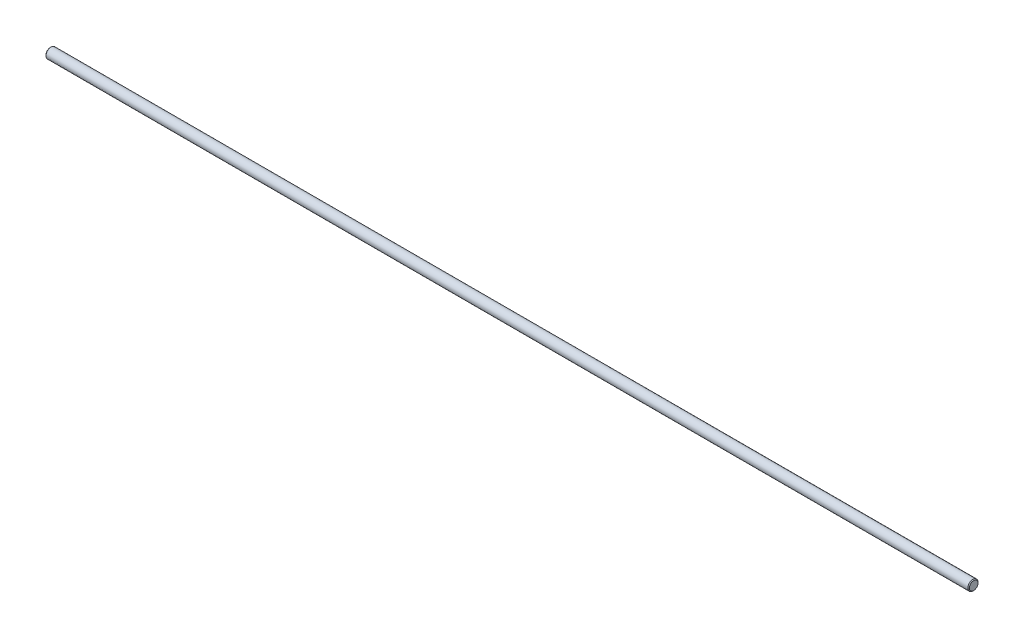
ISO-10303-21;
HEADER;
FILE_DESCRIPTION(('STEP AP214'),'2;1');
FILE_NAME('part.step','',(''),(''),'','','');
FILE_SCHEMA(('AUTOMOTIVE_DESIGN { 1 0 10303 214 1 1 1 1 }'));
ENDSEC;
DATA;
#1=APPLICATION_CONTEXT('core data for automotive mechanical design processes');
#2=APPLICATION_PROTOCOL_DEFINITION('international standard','automotive_design',2000,#1);
#3=PRODUCT_CONTEXT('',#1,'mechanical');
#4=PRODUCT('Part','Part','',(#3));
#5=PRODUCT_RELATED_PRODUCT_CATEGORY('part','',(#4));
#6=PRODUCT_DEFINITION_FORMATION('','',#4);
#7=PRODUCT_DEFINITION_CONTEXT('part definition',#1,'design');
#8=PRODUCT_DEFINITION('design','',#6,#7);
#9=PRODUCT_DEFINITION_SHAPE('','',#8);
#10=(LENGTH_UNIT() NAMED_UNIT(*) SI_UNIT(.MILLI.,.METRE.));
#11=(NAMED_UNIT(*) PLANE_ANGLE_UNIT() SI_UNIT($,.RADIAN.));
#12=(NAMED_UNIT(*) SI_UNIT($,.STERADIAN.) SOLID_ANGLE_UNIT());
#13=UNCERTAINTY_MEASURE_WITH_UNIT(LENGTH_MEASURE(1.E-05),#10,'distance_accuracy_value','');
#14=(GEOMETRIC_REPRESENTATION_CONTEXT(3) GLOBAL_UNCERTAINTY_ASSIGNED_CONTEXT((#13)) GLOBAL_UNIT_ASSIGNED_CONTEXT((#10,
#11,#12)) REPRESENTATION_CONTEXT('',''));
#15=CARTESIAN_POINT('',(0.,0.,0.));
#16=DIRECTION('',(0.,0.,1.));
#17=DIRECTION('',(1.,0.,0.));
#18=AXIS2_PLACEMENT_3D('',#15,#16,#17);
#19=CARTESIAN_POINT('',(182.,0.,0.));
#20=DIRECTION('',(-1.,0.,0.));
#21=DIRECTION('',(0.,0.,1.));
#22=AXIS2_PLACEMENT_3D('',#19,#20,#21);
#23=CYLINDRICAL_SURFACE('',#22,2.);
#24=CARTESIAN_POINT('',(-181.7,0.,0.));
#25=DIRECTION('',(1.,0.,0.));
#26=DIRECTION('',(0.,0.,-1.));
#27=AXIS2_PLACEMENT_3D('',#24,#25,#26);
#28=CIRCLE('',#27,2.);
#29=CARTESIAN_POINT('',(-181.7,0.,-2.));
#30=VERTEX_POINT('',#29);
#31=EDGE_CURVE('E51',#30,#30,#28,.T.);
#32=ORIENTED_EDGE('',*,*,#31,.T.);
#33=EDGE_LOOP('',(#32));
#34=FACE_BOUND('',#33,.T.);
#35=CARTESIAN_POINT('',(181.7,0.,0.));
#36=DIRECTION('',(1.,0.,0.));
#37=DIRECTION('',(0.,0.,-1.));
#38=AXIS2_PLACEMENT_3D('',#35,#36,#37);
#39=CIRCLE('',#38,2.);
#40=CARTESIAN_POINT('',(181.7,0.,-2.));
#41=VERTEX_POINT('',#40);
#42=EDGE_CURVE('E56',#41,#41,#39,.F.);
#43=ORIENTED_EDGE('',*,*,#42,.T.);
#44=EDGE_LOOP('',(#43));
#45=FACE_BOUND('',#44,.T.);
#46=ADVANCED_FACE('F37',(#34,#45),#23,.T.);
#47=CARTESIAN_POINT('',(182.,0.,0.));
#48=DIRECTION('',(1.,0.,0.));
#49=DIRECTION('',(0.,0.,-1.));
#50=AXIS2_PLACEMENT_3D('',#47,#48,#49);
#51=PLANE('',#50);
#52=CARTESIAN_POINT('',(182.,0.,0.));
#53=DIRECTION('',(1.,0.,0.));
#54=DIRECTION('',(0.,0.,-1.));
#55=AXIS2_PLACEMENT_3D('',#52,#53,#54);
#56=CIRCLE('',#55,1.69999999999998);
#57=CARTESIAN_POINT('',(182.,0.,-1.69999999999998));
#58=VERTEX_POINT('',#57);
#59=EDGE_CURVE('E10',#58,#58,#56,.T.);
#60=ORIENTED_EDGE('',*,*,#59,.T.);
#61=EDGE_LOOP('',(#60));
#62=FACE_BOUND('',#61,.T.);
#63=ADVANCED_FACE('F73',(#62),#51,.T.);
#64=CARTESIAN_POINT('',(-182.,0.,0.));
#65=DIRECTION('',(1.,0.,0.));
#66=DIRECTION('',(0.,0.,-1.));
#67=AXIS2_PLACEMENT_3D('',#64,#65,#66);
#68=PLANE('',#67);
#69=CARTESIAN_POINT('',(-182.,0.,0.));
#70=DIRECTION('',(1.,0.,0.));
#71=DIRECTION('',(0.,0.,-1.));
#72=AXIS2_PLACEMENT_3D('',#69,#70,#71);
#73=CIRCLE('',#72,1.69999999999992);
#74=CARTESIAN_POINT('',(-182.,0.,-1.69999999999992));
#75=VERTEX_POINT('',#74);
#76=EDGE_CURVE('E46',#75,#75,#73,.F.);
#77=ORIENTED_EDGE('',*,*,#76,.T.);
#78=EDGE_LOOP('',(#77));
#79=FACE_BOUND('',#78,.T.);
#80=ADVANCED_FACE('F70',(#79),#68,.F.);
#81=CARTESIAN_POINT('',(-181.7,0.,0.));
#82=DIRECTION('',(1.,0.,0.));
#83=DIRECTION('',(0.,0.,-1.));
#84=AXIS2_PLACEMENT_3D('',#81,#82,#83);
#85=CONICAL_SURFACE('',#84,2.,0.785398163397445);
#86=ORIENTED_EDGE('',*,*,#76,.F.);
#87=EDGE_LOOP('',(#86));
#88=FACE_BOUND('',#87,.T.);
#89=ORIENTED_EDGE('',*,*,#31,.F.);
#90=EDGE_LOOP('',(#89));
#91=FACE_BOUND('',#90,.T.);
#92=ADVANCED_FACE('F66',(#88,#91),#85,.T.);
#93=CARTESIAN_POINT('',(182.,0.,0.));
#94=DIRECTION('',(-1.,0.,0.));
#95=DIRECTION('',(0.,0.,1.));
#96=AXIS2_PLACEMENT_3D('',#93,#94,#95);
#97=CONICAL_SURFACE('',#96,1.69999999999998,0.785398163397445);
#98=ORIENTED_EDGE('',*,*,#42,.F.);
#99=EDGE_LOOP('',(#98));
#100=FACE_BOUND('',#99,.T.);
#101=ORIENTED_EDGE('',*,*,#59,.F.);
#102=EDGE_LOOP('',(#101));
#103=FACE_BOUND('',#102,.T.);
#104=ADVANCED_FACE('F40',(#100,#103),#97,.T.);
#105=CLOSED_SHELL('',(#46,#63,#80,#92,#104));
#106=MANIFOLD_SOLID_BREP('B2',#105);
#107=ADVANCED_BREP_SHAPE_REPRESENTATION('',(#18,#106),#14);
#108=SHAPE_DEFINITION_REPRESENTATION(#9,#107);
ENDSEC;
END-ISO-10303-21;
